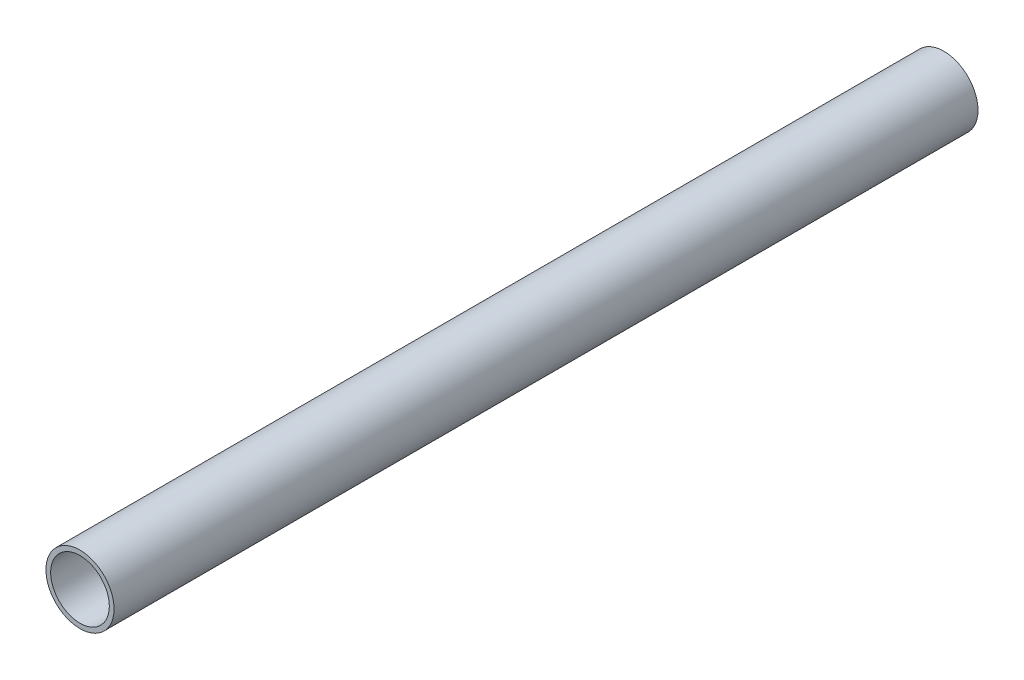
ISO-10303-21;
HEADER;
FILE_DESCRIPTION(('STEP AP214'),'2;1');
FILE_NAME('part.step','',(''),(''),'','','');
FILE_SCHEMA(('AUTOMOTIVE_DESIGN { 1 0 10303 214 1 1 1 1 }'));
ENDSEC;
DATA;
#1=APPLICATION_CONTEXT('core data for automotive mechanical design processes');
#2=APPLICATION_PROTOCOL_DEFINITION('international standard','automotive_design',2000,#1);
#3=PRODUCT_CONTEXT('',#1,'mechanical');
#4=PRODUCT('Part','Part','',(#3));
#5=PRODUCT_RELATED_PRODUCT_CATEGORY('part','',(#4));
#6=PRODUCT_DEFINITION_FORMATION('','',#4);
#7=PRODUCT_DEFINITION_CONTEXT('part definition',#1,'design');
#8=PRODUCT_DEFINITION('design','',#6,#7);
#9=PRODUCT_DEFINITION_SHAPE('','',#8);
#10=(LENGTH_UNIT() NAMED_UNIT(*) SI_UNIT(.MILLI.,.METRE.));
#11=(NAMED_UNIT(*) PLANE_ANGLE_UNIT() SI_UNIT($,.RADIAN.));
#12=(NAMED_UNIT(*) SI_UNIT($,.STERADIAN.) SOLID_ANGLE_UNIT());
#13=UNCERTAINTY_MEASURE_WITH_UNIT(LENGTH_MEASURE(1.E-05),#10,'distance_accuracy_value','');
#14=(GEOMETRIC_REPRESENTATION_CONTEXT(3) GLOBAL_UNCERTAINTY_ASSIGNED_CONTEXT((#13)) GLOBAL_UNIT_ASSIGNED_CONTEXT((#10,
#11,#12)) REPRESENTATION_CONTEXT('',''));
#15=CARTESIAN_POINT('',(0.,0.,0.));
#16=DIRECTION('',(0.,0.,1.));
#17=DIRECTION('',(1.,0.,0.));
#18=AXIS2_PLACEMENT_3D('',#15,#16,#17);
#19=CARTESIAN_POINT('',(0.,0.,191.55));
#20=DIRECTION('',(0.,0.,1.));
#21=DIRECTION('',(1.,0.,0.));
#22=AXIS2_PLACEMENT_3D('',#19,#20,#21);
#23=PLANE('',#22);
#24=CARTESIAN_POINT('',(0.,0.,191.55));
#25=DIRECTION('',(0.,0.,1.));
#26=DIRECTION('',(1.,0.,0.));
#27=AXIS2_PLACEMENT_3D('',#24,#25,#26);
#28=CIRCLE('',#27,7.55);
#29=CARTESIAN_POINT('',(7.55,0.,191.55));
#30=VERTEX_POINT('',#29);
#31=EDGE_CURVE('E10',#30,#30,#28,.T.);
#32=ORIENTED_EDGE('',*,*,#31,.T.);
#33=EDGE_LOOP('',(#32));
#34=FACE_BOUND('',#33,.T.);
#35=CARTESIAN_POINT('',(0.,0.,191.55));
#36=DIRECTION('',(0.,0.,1.));
#37=DIRECTION('',(1.,0.,0.));
#38=AXIS2_PLACEMENT_3D('',#35,#36,#37);
#39=CIRCLE('',#38,6.5);
#40=CARTESIAN_POINT('',(6.5,0.,191.55));
#41=VERTEX_POINT('',#40);
#42=EDGE_CURVE('E44',#41,#41,#39,.T.);
#43=ORIENTED_EDGE('',*,*,#42,.F.);
#44=EDGE_LOOP('',(#43));
#45=FACE_BOUND('',#44,.T.);
#46=ADVANCED_FACE('F33',(#34,#45),#23,.T.);
#47=CARTESIAN_POINT('',(0.,0.,0.));
#48=DIRECTION('',(0.,0.,1.));
#49=DIRECTION('',(1.,0.,0.));
#50=AXIS2_PLACEMENT_3D('',#47,#48,#49);
#51=PLANE('',#50);
#52=CARTESIAN_POINT('',(0.,0.,0.));
#53=DIRECTION('',(0.,0.,1.));
#54=DIRECTION('',(1.,0.,0.));
#55=AXIS2_PLACEMENT_3D('',#52,#53,#54);
#56=CIRCLE('',#55,7.55);
#57=CARTESIAN_POINT('',(7.55,0.,0.));
#58=VERTEX_POINT('',#57);
#59=EDGE_CURVE('E37',#58,#58,#56,.T.);
#60=ORIENTED_EDGE('',*,*,#59,.F.);
#61=EDGE_LOOP('',(#60));
#62=FACE_BOUND('',#61,.T.);
#63=CARTESIAN_POINT('',(0.,0.,0.));
#64=DIRECTION('',(0.,0.,1.));
#65=DIRECTION('',(1.,0.,0.));
#66=AXIS2_PLACEMENT_3D('',#63,#64,#65);
#67=CIRCLE('',#66,6.5);
#68=CARTESIAN_POINT('',(6.5,0.,0.));
#69=VERTEX_POINT('',#68);
#70=EDGE_CURVE('E46',#69,#69,#67,.T.);
#71=ORIENTED_EDGE('',*,*,#70,.T.);
#72=EDGE_LOOP('',(#71));
#73=FACE_BOUND('',#72,.T.);
#74=ADVANCED_FACE('F56',(#62,#73),#51,.F.);
#75=CARTESIAN_POINT('',(0.,0.,191.55));
#76=DIRECTION('',(0.,0.,-1.));
#77=DIRECTION('',(-1.,0.,0.));
#78=AXIS2_PLACEMENT_3D('',#75,#76,#77);
#79=CYLINDRICAL_SURFACE('',#78,7.55);
#80=ORIENTED_EDGE('',*,*,#31,.F.);
#81=EDGE_LOOP('',(#80));
#82=FACE_BOUND('',#81,.T.);
#83=ORIENTED_EDGE('',*,*,#59,.T.);
#84=EDGE_LOOP('',(#83));
#85=FACE_BOUND('',#84,.T.);
#86=ADVANCED_FACE('F35',(#82,#85),#79,.T.);
#87=CARTESIAN_POINT('',(0.,0.,191.55));
#88=DIRECTION('',(0.,0.,-1.));
#89=DIRECTION('',(-1.,0.,0.));
#90=AXIS2_PLACEMENT_3D('',#87,#88,#89);
#91=CYLINDRICAL_SURFACE('',#90,6.5);
#92=ORIENTED_EDGE('',*,*,#42,.T.);
#93=EDGE_LOOP('',(#92));
#94=FACE_BOUND('',#93,.T.);
#95=ORIENTED_EDGE('',*,*,#70,.F.);
#96=EDGE_LOOP('',(#95));
#97=FACE_BOUND('',#96,.T.);
#98=ADVANCED_FACE('F52',(#94,#97),#91,.F.);
#99=CLOSED_SHELL('',(#46,#74,#86,#98));
#100=MANIFOLD_SOLID_BREP('B2',#99);
#101=ADVANCED_BREP_SHAPE_REPRESENTATION('',(#18,#100),#14);
#102=SHAPE_DEFINITION_REPRESENTATION(#9,#101);
ENDSEC;
END-ISO-10303-21;
